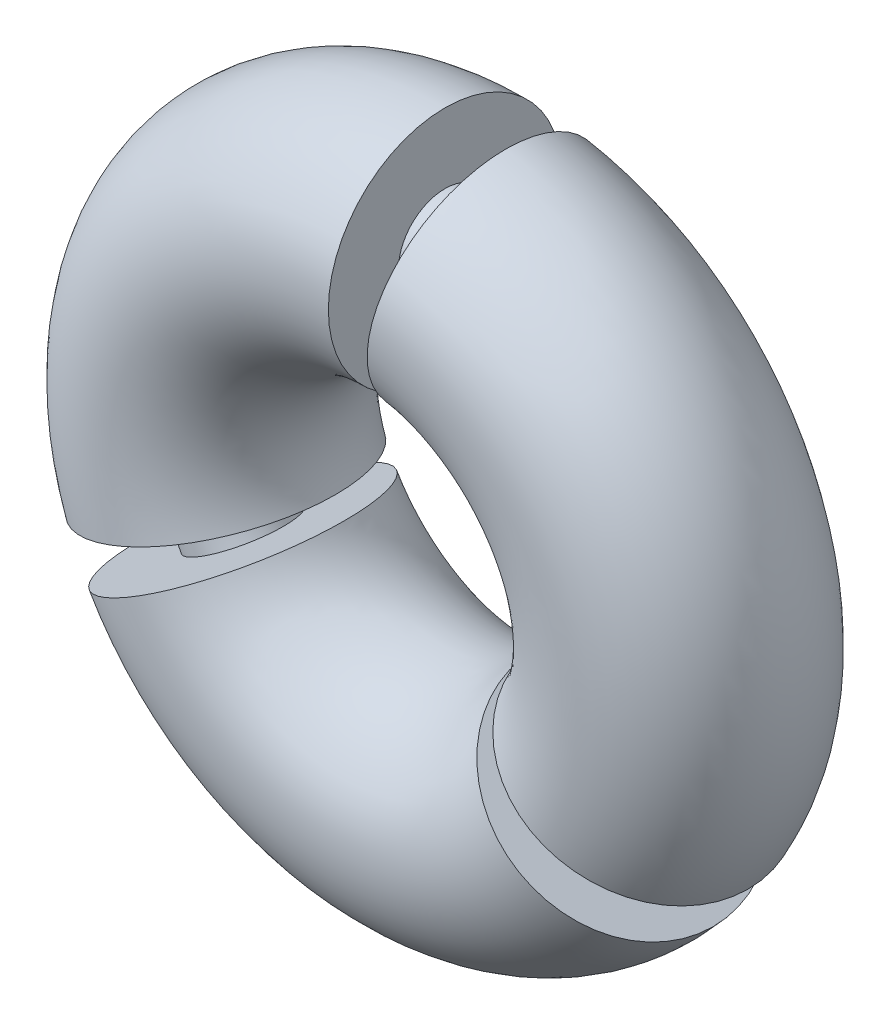
ISO-10303-21;
HEADER;
FILE_DESCRIPTION(('STEP AP214'),'2;1');
FILE_NAME('part.step','',(''),(''),'','','');
FILE_SCHEMA(('AUTOMOTIVE_DESIGN { 1 0 10303 214 1 1 1 1 }'));
ENDSEC;
DATA;
#1=APPLICATION_CONTEXT('core data for automotive mechanical design processes');
#2=APPLICATION_PROTOCOL_DEFINITION('international standard','automotive_design',2000,#1);
#3=PRODUCT_CONTEXT('',#1,'mechanical');
#4=PRODUCT('Part','Part','',(#3));
#5=PRODUCT_RELATED_PRODUCT_CATEGORY('part','',(#4));
#6=PRODUCT_DEFINITION_FORMATION('','',#4);
#7=PRODUCT_DEFINITION_CONTEXT('part definition',#1,'design');
#8=PRODUCT_DEFINITION('design','',#6,#7);
#9=PRODUCT_DEFINITION_SHAPE('','',#8);
#10=(LENGTH_UNIT() NAMED_UNIT(*) SI_UNIT(.MILLI.,.METRE.));
#11=(NAMED_UNIT(*) PLANE_ANGLE_UNIT() SI_UNIT($,.RADIAN.));
#12=(NAMED_UNIT(*) SI_UNIT($,.STERADIAN.) SOLID_ANGLE_UNIT());
#13=UNCERTAINTY_MEASURE_WITH_UNIT(LENGTH_MEASURE(1.E-05),#10,'distance_accuracy_value','');
#14=(GEOMETRIC_REPRESENTATION_CONTEXT(3) GLOBAL_UNCERTAINTY_ASSIGNED_CONTEXT((#13)) GLOBAL_UNIT_ASSIGNED_CONTEXT((#10,
#11,#12)) REPRESENTATION_CONTEXT('',''));
#15=CARTESIAN_POINT('',(0.,0.,0.));
#16=DIRECTION('',(0.,0.,1.));
#17=DIRECTION('',(1.,0.,0.));
#18=AXIS2_PLACEMENT_3D('',#15,#16,#17);
#19=CARTESIAN_POINT('',(1.73648177666918,9.8480775301221,0.));
#20=DIRECTION('',(0.98480775301221,-0.173648177666918,0.));
#21=DIRECTION('',(0.,0.,1.));
#22=AXIS2_PLACEMENT_3D('',#19,#20,#21);
#23=PLANE('',#22);
#24=CARTESIAN_POINT('',(1.73648177666918,9.8480775301221,0.));
#25=DIRECTION('',(-0.98480775301221,0.173648177666918,0.));
#26=DIRECTION('',(-0.173648177666918,-0.98480775301221,0.));
#27=AXIS2_PLACEMENT_3D('',#24,#25,#26);
#28=CIRCLE('',#27,2.);
#29=CARTESIAN_POINT('',(2.08377813200301,11.8176930361465,0.));
#30=VERTEX_POINT('',#29);
#31=EDGE_CURVE('E66',#30,#30,#28,.T.);
#32=ORIENTED_EDGE('',*,*,#31,.F.);
#33=EDGE_LOOP('',(#32));
#34=FACE_BOUND('',#33,.T.);
#35=CARTESIAN_POINT('',(1.73648177666918,9.8480775301221,0.));
#36=DIRECTION('',(0.98480775301221,-0.173648177666918,0.));
#37=DIRECTION('',(0.,0.,1.));
#38=AXIS2_PLACEMENT_3D('',#35,#36,#37);
#39=CIRCLE('',#38,5.);
#40=CARTESIAN_POINT('',(2.60472266500377,14.7721162951832,0.));
#41=VERTEX_POINT('',#40);
#42=EDGE_CURVE('E58',#41,#41,#39,.T.);
#43=ORIENTED_EDGE('',*,*,#42,.F.);
#44=EDGE_LOOP('',(#43));
#45=FACE_BOUND('',#44,.T.);
#46=ADVANCED_FACE('F52',(#34,#45),#23,.F.);
#47=CARTESIAN_POINT('',(8.66025403784443,-4.99999999999992,0.));
#48=DIRECTION('',(-0.499999999999992,-0.866025403784443,0.));
#49=DIRECTION('',(0.,0.,1.));
#50=AXIS2_PLACEMENT_3D('',#47,#48,#49);
#51=PLANE('',#50);
#52=CARTESIAN_POINT('',(8.66025403784443,-4.99999999999992,0.));
#53=DIRECTION('',(-0.499999999999992,-0.866025403784443,0.));
#54=DIRECTION('',(0.,0.,1.));
#55=AXIS2_PLACEMENT_3D('',#52,#53,#54);
#56=CIRCLE('',#55,5.);
#57=CARTESIAN_POINT('',(12.9903810567667,-7.49999999999988,0.));
#58=VERTEX_POINT('',#57);
#59=EDGE_CURVE('E11',#58,#58,#56,.T.);
#60=ORIENTED_EDGE('',*,*,#59,.T.);
#61=EDGE_LOOP('',(#60));
#62=FACE_BOUND('',#61,.T.);
#63=ADVANCED_FACE('F76',(#62),#51,.T.);
#64=CARTESIAN_POINT('',(0.,0.,0.));
#65=DIRECTION('',(0.,0.,-1.));
#66=DIRECTION('',(0.499999999999992,0.866025403784443,0.));
#67=AXIS2_PLACEMENT_3D('',#64,#65,#66);
#68=TOROIDAL_SURFACE('',#67,10.,5.);
#69=CARTESIAN_POINT('',(0.,0.,0.));
#70=DIRECTION('',(0.,0.,-1.));
#71=DIRECTION('',(0.499999999999992,0.866025403784443,0.));
#72=AXIS2_PLACEMENT_3D('',#69,#70,#71);
#73=CIRCLE('',#72,15.);
#74=EDGE_CURVE('',#41,#58,#73,.T.);
#75=ORIENTED_EDGE('',*,*,#42,.T.);
#76=ORIENTED_EDGE('',*,*,#59,.F.);
#77=ORIENTED_EDGE('',*,*,#74,.T.);
#78=ORIENTED_EDGE('',*,*,#74,.F.);
#79=EDGE_LOOP('',(#75,#77,#76,#78));
#80=FACE_BOUND('',#79,.T.);
#81=ADVANCED_FACE('F80',(#80),#68,.T.);
#82=CARTESIAN_POINT('',(-1.38777878078145E-13,10.,0.));
#83=DIRECTION('',(-1.,0.,0.));
#84=DIRECTION('',(0.,-1.,0.));
#85=AXIS2_PLACEMENT_3D('',#82,#83,#84);
#86=PLANE('',#85);
#87=CARTESIAN_POINT('',(-1.38777878078145E-13,10.,0.));
#88=DIRECTION('',(-1.,0.,0.));
#89=DIRECTION('',(0.,-1.,0.));
#90=AXIS2_PLACEMENT_3D('',#87,#88,#89);
#91=CIRCLE('',#90,2.);
#92=CARTESIAN_POINT('',(-1.66533453693773E-13,12.,0.));
#93=VERTEX_POINT('',#92);
#94=EDGE_CURVE('E62',#93,#93,#91,.T.);
#95=ORIENTED_EDGE('',*,*,#94,.T.);
#96=EDGE_LOOP('',(#95));
#97=FACE_BOUND('',#96,.T.);
#98=ADVANCED_FACE('F82',(#97),#86,.T.);
#99=CARTESIAN_POINT('',(0.,0.,0.));
#100=DIRECTION('',(0.,0.,1.));
#101=DIRECTION('',(-0.499999999999992,-0.866025403784443,0.));
#102=AXIS2_PLACEMENT_3D('',#99,#100,#101);
#103=TOROIDAL_SURFACE('',#102,10.,2.);
#104=CARTESIAN_POINT('',(0.,0.,0.));
#105=DIRECTION('',(0.,0.,1.));
#106=DIRECTION('',(-0.499999999999992,-0.866025403784443,0.));
#107=AXIS2_PLACEMENT_3D('',#104,#105,#106);
#108=CIRCLE('',#107,12.);
#109=EDGE_CURVE('',#30,#93,#108,.T.);
#110=ORIENTED_EDGE('',*,*,#31,.T.);
#111=ORIENTED_EDGE('',*,*,#94,.F.);
#112=ORIENTED_EDGE('',*,*,#109,.T.);
#113=ORIENTED_EDGE('',*,*,#109,.F.);
#114=EDGE_LOOP('',(#110,#112,#111,#113));
#115=FACE_BOUND('',#114,.T.);
#116=ADVANCED_FACE('F72',(#115),#103,.T.);
#117=CLOSED_SHELL('',(#46,#63,#81,#98,#116));
#118=MANIFOLD_SOLID_BREP('B2',#117);
#119=CARTESIAN_POINT('',(7.66044443118983,-6.42787609686533,0.));
#120=DIRECTION('',(-0.642787609686533,-0.766044443118983,0.));
#121=DIRECTION('',(0.,0.,1.));
#122=AXIS2_PLACEMENT_3D('',#119,#120,#121);
#123=PLANE('',#122);
#124=CARTESIAN_POINT('',(7.66044443118984,-6.42787609686533,0.));
#125=DIRECTION('',(0.642787609686533,0.766044443118983,0.));
#126=DIRECTION('',(-0.766044443118983,0.642787609686533,0.));
#127=AXIS2_PLACEMENT_3D('',#124,#125,#126);
#128=CIRCLE('',#127,2.);
#129=CARTESIAN_POINT('',(9.1925333174278,-7.7134513162384,0.));
#130=VERTEX_POINT('',#129);
#131=EDGE_CURVE('E147',#130,#130,#128,.T.);
#132=ORIENTED_EDGE('',*,*,#131,.F.);
#133=EDGE_LOOP('',(#132));
#134=FACE_BOUND('',#133,.T.);
#135=CARTESIAN_POINT('',(7.66044443118983,-6.42787609686533,0.));
#136=DIRECTION('',(-0.642787609686533,-0.766044443118983,0.));
#137=DIRECTION('',(0.,0.,1.));
#138=AXIS2_PLACEMENT_3D('',#135,#136,#137);
#139=CIRCLE('',#138,5.);
#140=CARTESIAN_POINT('',(11.4906666467848,-9.64181414529799,0.));
#141=VERTEX_POINT('',#140);
#142=EDGE_CURVE('E137',#141,#141,#139,.T.);
#143=ORIENTED_EDGE('',*,*,#142,.F.);
#144=EDGE_LOOP('',(#143));
#145=FACE_BOUND('',#144,.T.);
#146=ADVANCED_FACE('F130',(#134,#145),#123,.F.);
#147=CARTESIAN_POINT('',(-8.66025403784437,-5.00000000000004,0.));
#148=DIRECTION('',(-0.500000000000004,0.866025403784436,0.));
#149=DIRECTION('',(0.,0.,1.));
#150=AXIS2_PLACEMENT_3D('',#147,#148,#149);
#151=PLANE('',#150);
#152=CARTESIAN_POINT('',(-8.66025403784437,-5.00000000000004,0.));
#153=DIRECTION('',(-0.500000000000004,0.866025403784436,0.));
#154=DIRECTION('',(0.,0.,1.));
#155=AXIS2_PLACEMENT_3D('',#152,#153,#154);
#156=CIRCLE('',#155,5.);
#157=CARTESIAN_POINT('',(-12.9903810567665,-7.50000000000006,0.));
#158=VERTEX_POINT('',#157);
#159=EDGE_CURVE('E51',#158,#158,#156,.T.);
#160=ORIENTED_EDGE('',*,*,#159,.T.);
#161=EDGE_LOOP('',(#160));
#162=FACE_BOUND('',#161,.T.);
#163=ADVANCED_FACE('F158',(#162),#151,.T.);
#164=CARTESIAN_POINT('',(0.,0.,0.));
#165=DIRECTION('',(0.,0.,-1.));
#166=DIRECTION('',(0.500000000000004,-0.866025403784436,0.));
#167=AXIS2_PLACEMENT_3D('',#164,#165,#166);
#168=TOROIDAL_SURFACE('',#167,10.,5.);
#169=CARTESIAN_POINT('',(0.,0.,0.));
#170=DIRECTION('',(0.,0.,-1.));
#171=DIRECTION('',(0.500000000000004,-0.866025403784436,0.));
#172=AXIS2_PLACEMENT_3D('',#169,#170,#171);
#173=CIRCLE('',#172,15.);
#174=EDGE_CURVE('',#141,#158,#173,.T.);
#175=ORIENTED_EDGE('',*,*,#142,.T.);
#176=ORIENTED_EDGE('',*,*,#159,.F.);
#177=ORIENTED_EDGE('',*,*,#174,.T.);
#178=ORIENTED_EDGE('',*,*,#174,.F.);
#179=EDGE_LOOP('',(#175,#177,#176,#178));
#180=FACE_BOUND('',#179,.T.);
#181=ADVANCED_FACE('F162',(#180),#168,.T.);
#182=CARTESIAN_POINT('',(8.66025403784444,-4.99999999999992,0.));
#183=DIRECTION('',(0.499999999999992,0.866025403784444,0.));
#184=DIRECTION('',(-0.866025403784443,0.499999999999992,0.));
#185=AXIS2_PLACEMENT_3D('',#182,#183,#184);
#186=PLANE('',#185);
#187=CARTESIAN_POINT('',(8.66025403784444,-4.99999999999992,0.));
#188=DIRECTION('',(0.499999999999992,0.866025403784444,0.));
#189=DIRECTION('',(-0.866025403784443,0.499999999999992,0.));
#190=AXIS2_PLACEMENT_3D('',#187,#188,#189);
#191=CIRCLE('',#190,2.);
#192=CARTESIAN_POINT('',(10.3923048454133,-5.9999999999999,0.));
#193=VERTEX_POINT('',#192);
#194=EDGE_CURVE('E142',#193,#193,#191,.T.);
#195=ORIENTED_EDGE('',*,*,#194,.T.);
#196=EDGE_LOOP('',(#195));
#197=FACE_BOUND('',#196,.T.);
#198=ADVANCED_FACE('F164',(#197),#186,.T.);
#199=CARTESIAN_POINT('',(0.,0.,0.));
#200=DIRECTION('',(0.,0.,1.));
#201=DIRECTION('',(-0.500000000000004,0.866025403784436,0.));
#202=AXIS2_PLACEMENT_3D('',#199,#200,#201);
#203=TOROIDAL_SURFACE('',#202,10.,2.);
#204=CARTESIAN_POINT('',(0.,0.,0.));
#205=DIRECTION('',(0.,0.,1.));
#206=DIRECTION('',(-0.500000000000004,0.866025403784436,0.));
#207=AXIS2_PLACEMENT_3D('',#204,#205,#206);
#208=CIRCLE('',#207,12.);
#209=EDGE_CURVE('',#130,#193,#208,.T.);
#210=ORIENTED_EDGE('',*,*,#131,.T.);
#211=ORIENTED_EDGE('',*,*,#194,.F.);
#212=ORIENTED_EDGE('',*,*,#209,.T.);
#213=ORIENTED_EDGE('',*,*,#209,.F.);
#214=EDGE_LOOP('',(#210,#212,#211,#213));
#215=FACE_BOUND('',#214,.T.);
#216=ADVANCED_FACE('F154',(#215),#203,.T.);
#217=CLOSED_SHELL('',(#146,#163,#181,#198,#216));
#218=MANIFOLD_SOLID_BREP('B6',#217);
#219=CARTESIAN_POINT('',(-9.39692620785907,-3.42020143325672,0.));
#220=DIRECTION('',(-0.342020143325672,0.939692620785907,0.));
#221=DIRECTION('',(0.,0.,1.));
#222=AXIS2_PLACEMENT_3D('',#219,#220,#221);
#223=PLANE('',#222);
#224=CARTESIAN_POINT('',(-9.39692620785907,-3.42020143325672,0.));
#225=DIRECTION('',(0.342020143325672,-0.939692620785907,0.));
#226=DIRECTION('',(0.939692620785907,0.342020143325672,0.));
#227=AXIS2_PLACEMENT_3D('',#224,#225,#226);
#228=CIRCLE('',#227,2.);
#229=CARTESIAN_POINT('',(-11.2763114494309,-4.10424171990807,0.));
#230=VERTEX_POINT('',#229);
#231=EDGE_CURVE('E219',#230,#230,#228,.T.);
#232=ORIENTED_EDGE('',*,*,#231,.F.);
#233=EDGE_LOOP('',(#232));
#234=FACE_BOUND('',#233,.T.);
#235=CARTESIAN_POINT('',(-9.39692620785907,-3.42020143325672,0.));
#236=DIRECTION('',(-0.342020143325672,0.939692620785907,0.));
#237=DIRECTION('',(0.,0.,1.));
#238=AXIS2_PLACEMENT_3D('',#235,#236,#237);
#239=CIRCLE('',#238,5.);
#240=CARTESIAN_POINT('',(-14.0953893117886,-5.13030214988508,0.));
#241=VERTEX_POINT('',#240);
#242=EDGE_CURVE('E211',#241,#241,#239,.T.);
#243=ORIENTED_EDGE('',*,*,#242,.F.);
#244=EDGE_LOOP('',(#243));
#245=FACE_BOUND('',#244,.T.);
#246=ADVANCED_FACE('F205',(#234,#245),#223,.F.);
#247=CARTESIAN_POINT('',(0.,10.,0.));
#248=DIRECTION('',(1.,0.,0.));
#249=DIRECTION('',(0.,0.,1.));
#250=AXIS2_PLACEMENT_3D('',#247,#248,#249);
#251=PLANE('',#250);
#252=CARTESIAN_POINT('',(0.,10.,0.));
#253=DIRECTION('',(1.,0.,0.));
#254=DIRECTION('',(0.,0.,1.));
#255=AXIS2_PLACEMENT_3D('',#252,#253,#254);
#256=CIRCLE('',#255,5.);
#257=CARTESIAN_POINT('',(0.,15.,0.));
#258=VERTEX_POINT('',#257);
#259=EDGE_CURVE('E129',#258,#258,#256,.T.);
#260=ORIENTED_EDGE('',*,*,#259,.T.);
#261=EDGE_LOOP('',(#260));
#262=FACE_BOUND('',#261,.T.);
#263=ADVANCED_FACE('F229',(#262),#251,.T.);
#264=CARTESIAN_POINT('',(0.,0.,0.));
#265=DIRECTION('',(0.,0.,-1.));
#266=DIRECTION('',(-1.,0.,0.));
#267=AXIS2_PLACEMENT_3D('',#264,#265,#266);
#268=TOROIDAL_SURFACE('',#267,10.,5.);
#269=CARTESIAN_POINT('',(0.,0.,0.));
#270=DIRECTION('',(0.,0.,-1.));
#271=DIRECTION('',(-1.,0.,0.));
#272=AXIS2_PLACEMENT_3D('',#269,#270,#271);
#273=CIRCLE('',#272,15.);
#274=EDGE_CURVE('',#241,#258,#273,.T.);
#275=ORIENTED_EDGE('',*,*,#242,.T.);
#276=ORIENTED_EDGE('',*,*,#259,.F.);
#277=ORIENTED_EDGE('',*,*,#274,.T.);
#278=ORIENTED_EDGE('',*,*,#274,.F.);
#279=EDGE_LOOP('',(#275,#277,#276,#278));
#280=FACE_BOUND('',#279,.T.);
#281=ADVANCED_FACE('F235',(#280),#268,.T.);
#282=CARTESIAN_POINT('',(-8.66025403784436,-5.00000000000004,0.));
#283=DIRECTION('',(0.500000000000004,-0.866025403784436,0.));
#284=DIRECTION('',(0.866025403784436,0.500000000000004,0.));
#285=AXIS2_PLACEMENT_3D('',#282,#283,#284);
#286=PLANE('',#285);
#287=CARTESIAN_POINT('',(-8.66025403784436,-5.00000000000004,0.));
#288=DIRECTION('',(0.500000000000004,-0.866025403784436,0.));
#289=DIRECTION('',(0.866025403784436,0.500000000000004,0.));
#290=AXIS2_PLACEMENT_3D('',#287,#288,#289);
#291=CIRCLE('',#290,2.);
#292=CARTESIAN_POINT('',(-10.3923048454132,-6.00000000000005,0.));
#293=VERTEX_POINT('',#292);
#294=EDGE_CURVE('E215',#293,#293,#291,.T.);
#295=ORIENTED_EDGE('',*,*,#294,.T.);
#296=EDGE_LOOP('',(#295));
#297=FACE_BOUND('',#296,.T.);
#298=ADVANCED_FACE('F237',(#297),#286,.T.);
#299=CARTESIAN_POINT('',(0.,0.,0.));
#300=DIRECTION('',(0.,0.,1.));
#301=DIRECTION('',(1.,0.,0.));
#302=AXIS2_PLACEMENT_3D('',#299,#300,#301);
#303=TOROIDAL_SURFACE('',#302,10.,2.);
#304=CARTESIAN_POINT('',(0.,0.,0.));
#305=DIRECTION('',(0.,0.,1.));
#306=DIRECTION('',(1.,0.,0.));
#307=AXIS2_PLACEMENT_3D('',#304,#305,#306);
#308=CIRCLE('',#307,12.);
#309=EDGE_CURVE('',#230,#293,#308,.T.);
#310=ORIENTED_EDGE('',*,*,#231,.T.);
#311=ORIENTED_EDGE('',*,*,#294,.F.);
#312=ORIENTED_EDGE('',*,*,#309,.T.);
#313=ORIENTED_EDGE('',*,*,#309,.F.);
#314=EDGE_LOOP('',(#310,#312,#311,#313));
#315=FACE_BOUND('',#314,.T.);
#316=ADVANCED_FACE('F225',(#315),#303,.T.);
#317=CLOSED_SHELL('',(#246,#263,#281,#298,#316));
#318=MANIFOLD_SOLID_BREP('B46',#317);
#319=ADVANCED_BREP_SHAPE_REPRESENTATION('',(#18,#118,#218,#318),#14);
#320=SHAPE_DEFINITION_REPRESENTATION(#9,#319);
ENDSEC;
END-ISO-10303-21;
